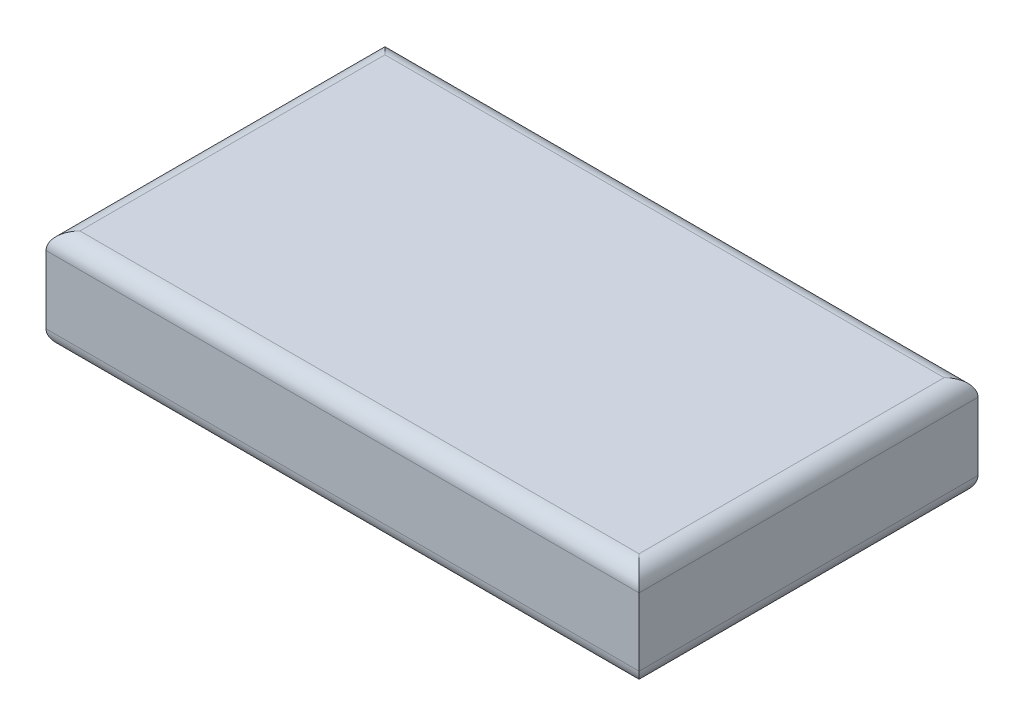
ISO-10303-21;
HEADER;
FILE_DESCRIPTION(('STEP AP214'),'2;1');
FILE_NAME('part.step','',(''),(''),'','','');
FILE_SCHEMA(('AUTOMOTIVE_DESIGN { 1 0 10303 214 1 1 1 1 }'));
ENDSEC;
DATA;
#1=APPLICATION_CONTEXT('core data for automotive mechanical design processes');
#2=APPLICATION_PROTOCOL_DEFINITION('international standard','automotive_design',2000,#1);
#3=PRODUCT_CONTEXT('',#1,'mechanical');
#4=PRODUCT('Part','Part','',(#3));
#5=PRODUCT_RELATED_PRODUCT_CATEGORY('part','',(#4));
#6=PRODUCT_DEFINITION_FORMATION('','',#4);
#7=PRODUCT_DEFINITION_CONTEXT('part definition',#1,'design');
#8=PRODUCT_DEFINITION('design','',#6,#7);
#9=PRODUCT_DEFINITION_SHAPE('','',#8);
#10=(LENGTH_UNIT() NAMED_UNIT(*) SI_UNIT(.MILLI.,.METRE.));
#11=(NAMED_UNIT(*) PLANE_ANGLE_UNIT() SI_UNIT($,.RADIAN.));
#12=(NAMED_UNIT(*) SI_UNIT($,.STERADIAN.) SOLID_ANGLE_UNIT());
#13=UNCERTAINTY_MEASURE_WITH_UNIT(LENGTH_MEASURE(1.E-05),#10,'distance_accuracy_value','');
#14=(GEOMETRIC_REPRESENTATION_CONTEXT(3) GLOBAL_UNCERTAINTY_ASSIGNED_CONTEXT((#13)) GLOBAL_UNIT_ASSIGNED_CONTEXT((#10,
#11,#12)) REPRESENTATION_CONTEXT('',''));
#15=CARTESIAN_POINT('',(0.,0.,0.));
#16=DIRECTION('',(0.,0.,1.));
#17=DIRECTION('',(1.,0.,0.));
#18=AXIS2_PLACEMENT_3D('',#15,#16,#17);
#19=CARTESIAN_POINT('',(17.5,6.,-10.));
#20=DIRECTION('',(-1.,0.,0.));
#21=DIRECTION('',(0.,0.,1.));
#22=AXIS2_PLACEMENT_3D('',#19,#20,#21);
#23=PLANE('',#22);
#24=DIRECTION('',(0.,-1.,0.));
#25=VECTOR('',#24,1.);
#26=CARTESIAN_POINT('',(17.5,6.,10.));
#27=LINE('',#26,#25);
#28=CARTESIAN_POINT('',(17.5,5.,10.));
#29=VERTEX_POINT('',#28);
#30=CARTESIAN_POINT('',(17.5,1.,10.));
#31=VERTEX_POINT('',#30);
#32=EDGE_CURVE('E158',#29,#31,#27,.T.);
#33=ORIENTED_EDGE('',*,*,#32,.T.);
#34=DIRECTION('',(0.,0.,-1.));
#35=VECTOR('',#34,1.);
#36=CARTESIAN_POINT('',(17.5,1.,-10.));
#37=LINE('',#36,#35);
#38=CARTESIAN_POINT('',(17.5,1.,-10.));
#39=VERTEX_POINT('',#38);
#40=EDGE_CURVE('E172',#31,#39,#37,.T.);
#41=ORIENTED_EDGE('',*,*,#40,.T.);
#42=DIRECTION('',(0.,-1.,0.));
#43=VECTOR('',#42,1.);
#44=CARTESIAN_POINT('',(17.5,6.,-10.));
#45=LINE('',#44,#43);
#46=CARTESIAN_POINT('',(17.5,5.,-10.));
#47=VERTEX_POINT('',#46);
#48=EDGE_CURVE('E129',#47,#39,#45,.T.);
#49=ORIENTED_EDGE('',*,*,#48,.F.);
#50=DIRECTION('',(0.,0.,-1.));
#51=VECTOR('',#50,1.);
#52=CARTESIAN_POINT('',(17.5,5.,10.));
#53=LINE('',#52,#51);
#54=EDGE_CURVE('E175',#47,#29,#53,.F.);
#55=ORIENTED_EDGE('',*,*,#54,.T.);
#56=EDGE_LOOP('',(#33,#41,#49,#55));
#57=FACE_BOUND('',#56,.T.);
#58=ADVANCED_FACE('F39',(#57),#23,.F.);
#59=CARTESIAN_POINT('',(-17.5,6.,-10.));
#60=DIRECTION('',(0.,0.,1.));
#61=DIRECTION('',(1.,0.,0.));
#62=AXIS2_PLACEMENT_3D('',#59,#60,#61);
#63=PLANE('',#62);
#64=ORIENTED_EDGE('',*,*,#48,.T.);
#65=DIRECTION('',(-1.,0.,0.));
#66=VECTOR('',#65,1.);
#67=CARTESIAN_POINT('',(-17.5,1.,-10.));
#68=LINE('',#67,#66);
#69=CARTESIAN_POINT('',(-17.5,1.,-10.));
#70=VERTEX_POINT('',#69);
#71=EDGE_CURVE('E127',#39,#70,#68,.T.);
#72=ORIENTED_EDGE('',*,*,#71,.T.);
#73=DIRECTION('',(0.,-1.,0.));
#74=VECTOR('',#73,1.);
#75=CARTESIAN_POINT('',(-17.5,6.,-10.));
#76=LINE('',#75,#74);
#77=CARTESIAN_POINT('',(-17.5,5.,-10.));
#78=VERTEX_POINT('',#77);
#79=EDGE_CURVE('E109',#78,#70,#76,.T.);
#80=ORIENTED_EDGE('',*,*,#79,.F.);
#81=DIRECTION('',(-1.,0.,0.));
#82=VECTOR('',#81,1.);
#83=CARTESIAN_POINT('',(17.5,5.,-10.));
#84=LINE('',#83,#82);
#85=EDGE_CURVE('E124',#78,#47,#84,.F.);
#86=ORIENTED_EDGE('',*,*,#85,.T.);
#87=EDGE_LOOP('',(#64,#72,#80,#86));
#88=FACE_BOUND('',#87,.T.);
#89=ADVANCED_FACE('F123',(#88),#63,.F.);
#90=CARTESIAN_POINT('',(-17.5,6.,-10.));
#91=DIRECTION('',(1.,0.,0.));
#92=DIRECTION('',(0.,0.,-1.));
#93=AXIS2_PLACEMENT_3D('',#90,#91,#92);
#94=PLANE('',#93);
#95=ORIENTED_EDGE('',*,*,#79,.T.);
#96=DIRECTION('',(0.,0.,1.));
#97=VECTOR('',#96,1.);
#98=CARTESIAN_POINT('',(-17.5,1.,-10.));
#99=LINE('',#98,#97);
#100=CARTESIAN_POINT('',(-17.5,1.,10.));
#101=VERTEX_POINT('',#100);
#102=EDGE_CURVE('E116',#70,#101,#99,.T.);
#103=ORIENTED_EDGE('',*,*,#102,.T.);
#104=DIRECTION('',(0.,-1.,0.));
#105=VECTOR('',#104,1.);
#106=CARTESIAN_POINT('',(-17.5,6.,10.));
#107=LINE('',#106,#105);
#108=CARTESIAN_POINT('',(-17.5,5.,10.));
#109=VERTEX_POINT('',#108);
#110=EDGE_CURVE('E111',#109,#101,#107,.T.);
#111=ORIENTED_EDGE('',*,*,#110,.F.);
#112=DIRECTION('',(0.,0.,1.));
#113=VECTOR('',#112,1.);
#114=CARTESIAN_POINT('',(-17.5,5.,-10.));
#115=LINE('',#114,#113);
#116=EDGE_CURVE('E106',#109,#78,#115,.F.);
#117=ORIENTED_EDGE('',*,*,#116,.T.);
#118=EDGE_LOOP('',(#95,#103,#111,#117));
#119=FACE_BOUND('',#118,.T.);
#120=ADVANCED_FACE('F108',(#119),#94,.F.);
#121=CARTESIAN_POINT('',(-17.5,6.,10.));
#122=DIRECTION('',(0.,0.,-1.));
#123=DIRECTION('',(-1.,0.,0.));
#124=AXIS2_PLACEMENT_3D('',#121,#122,#123);
#125=PLANE('',#124);
#126=ORIENTED_EDGE('',*,*,#110,.T.);
#127=DIRECTION('',(1.,0.,0.));
#128=VECTOR('',#127,1.);
#129=CARTESIAN_POINT('',(-17.5,1.,10.));
#130=LINE('',#129,#128);
#131=EDGE_CURVE('E178',#101,#31,#130,.T.);
#132=ORIENTED_EDGE('',*,*,#131,.T.);
#133=ORIENTED_EDGE('',*,*,#32,.F.);
#134=DIRECTION('',(1.,0.,0.));
#135=VECTOR('',#134,1.);
#136=CARTESIAN_POINT('',(-17.5,5.,10.));
#137=LINE('',#136,#135);
#138=EDGE_CURVE('E181',#29,#109,#137,.F.);
#139=ORIENTED_EDGE('',*,*,#138,.T.);
#140=EDGE_LOOP('',(#126,#132,#133,#139));
#141=FACE_BOUND('',#140,.T.);
#142=ADVANCED_FACE('F229',(#141),#125,.F.);
#143=CARTESIAN_POINT('',(0.,6.,0.));
#144=DIRECTION('',(0.,1.,0.));
#145=DIRECTION('',(0.,0.,1.));
#146=AXIS2_PLACEMENT_3D('',#143,#144,#145);
#147=PLANE('',#146);
#148=DIRECTION('',(0.,0.,1.));
#149=VECTOR('',#148,1.);
#150=CARTESIAN_POINT('',(-16.5,6.,10.));
#151=LINE('',#150,#149);
#152=CARTESIAN_POINT('',(-16.5,6.,-9.));
#153=VERTEX_POINT('',#152);
#154=CARTESIAN_POINT('',(-16.5,6.,9.00000000000001));
#155=VERTEX_POINT('',#154);
#156=EDGE_CURVE('E49',#153,#155,#151,.T.);
#157=ORIENTED_EDGE('',*,*,#156,.T.);
#158=DIRECTION('',(1.,0.,0.));
#159=VECTOR('',#158,1.);
#160=CARTESIAN_POINT('',(17.5,6.,9.00000000000001));
#161=LINE('',#160,#159);
#162=CARTESIAN_POINT('',(16.5,6.,9.00000000000001));
#163=VERTEX_POINT('',#162);
#164=EDGE_CURVE('E11',#155,#163,#161,.T.);
#165=ORIENTED_EDGE('',*,*,#164,.T.);
#166=DIRECTION('',(0.,0.,-1.));
#167=VECTOR('',#166,1.);
#168=CARTESIAN_POINT('',(16.5,6.,-10.));
#169=LINE('',#168,#167);
#170=CARTESIAN_POINT('',(16.5,6.,-9.));
#171=VERTEX_POINT('',#170);
#172=EDGE_CURVE('E169',#163,#171,#169,.T.);
#173=ORIENTED_EDGE('',*,*,#172,.T.);
#174=DIRECTION('',(-1.,0.,0.));
#175=VECTOR('',#174,1.);
#176=CARTESIAN_POINT('',(-17.5,6.,-9.));
#177=LINE('',#176,#175);
#178=EDGE_CURVE('E60',#171,#153,#177,.T.);
#179=ORIENTED_EDGE('',*,*,#178,.T.);
#180=EDGE_LOOP('',(#157,#165,#173,#179));
#181=FACE_BOUND('',#180,.T.);
#182=ADVANCED_FACE('F235',(#181),#147,.T.);
#183=CARTESIAN_POINT('',(0.,0.,0.));
#184=DIRECTION('',(0.,1.,0.));
#185=DIRECTION('',(0.,0.,1.));
#186=AXIS2_PLACEMENT_3D('',#183,#184,#185);
#187=PLANE('',#186);
#188=DIRECTION('',(0.,0.,1.));
#189=VECTOR('',#188,1.);
#190=CARTESIAN_POINT('',(-16.5,0.,0.));
#191=LINE('',#190,#189);
#192=CARTESIAN_POINT('',(-16.5,0.,9.00000000000001));
#193=VERTEX_POINT('',#192);
#194=CARTESIAN_POINT('',(-16.5,0.,-9.));
#195=VERTEX_POINT('',#194);
#196=EDGE_CURVE('E189',#193,#195,#191,.F.);
#197=ORIENTED_EDGE('',*,*,#196,.T.);
#198=DIRECTION('',(-1.,0.,0.));
#199=VECTOR('',#198,1.);
#200=CARTESIAN_POINT('',(0.,0.,-9.));
#201=LINE('',#200,#199);
#202=CARTESIAN_POINT('',(16.5,0.,-9.));
#203=VERTEX_POINT('',#202);
#204=EDGE_CURVE('E117',#195,#203,#201,.F.);
#205=ORIENTED_EDGE('',*,*,#204,.T.);
#206=DIRECTION('',(0.,0.,-1.));
#207=VECTOR('',#206,1.);
#208=CARTESIAN_POINT('',(16.5,0.,0.));
#209=LINE('',#208,#207);
#210=CARTESIAN_POINT('',(16.5,0.,9.00000000000001));
#211=VERTEX_POINT('',#210);
#212=EDGE_CURVE('E195',#203,#211,#209,.F.);
#213=ORIENTED_EDGE('',*,*,#212,.T.);
#214=DIRECTION('',(1.,0.,0.));
#215=VECTOR('',#214,1.);
#216=CARTESIAN_POINT('',(0.,0.,9.00000000000001));
#217=LINE('',#216,#215);
#218=EDGE_CURVE('E192',#211,#193,#217,.F.);
#219=ORIENTED_EDGE('',*,*,#218,.T.);
#220=EDGE_LOOP('',(#197,#205,#213,#219));
#221=FACE_BOUND('',#220,.T.);
#222=ADVANCED_FACE('F237',(#221),#187,.F.);
#223=CARTESIAN_POINT('',(-17.5,1.,9.00000000000001));
#224=DIRECTION('',(1.,0.,0.));
#225=DIRECTION('',(0.,0.,-1.));
#226=AXIS2_PLACEMENT_3D('',#223,#224,#225);
#227=CYLINDRICAL_SURFACE('',#226,1.);
#228=CARTESIAN_POINT('',(-16.5,1.,9.00000000000001));
#229=DIRECTION('',(0.707106781186548,0.,0.707106781186547));
#230=DIRECTION('',(0.707106781186547,0.,-0.707106781186548));
#231=AXIS2_PLACEMENT_3D('',#228,#229,#230);
#232=ELLIPSE('',#231,1.41421356237309,1.);
#233=EDGE_CURVE('E159',#193,#101,#232,.F.);
#234=ORIENTED_EDGE('',*,*,#233,.F.);
#235=ORIENTED_EDGE('',*,*,#218,.F.);
#236=CARTESIAN_POINT('',(16.5,1.,9.00000000000001));
#237=DIRECTION('',(0.707106781186547,0.,-0.707106781186548));
#238=DIRECTION('',(-0.707106781186548,0.,-0.707106781186547));
#239=AXIS2_PLACEMENT_3D('',#236,#237,#238);
#240=ELLIPSE('',#239,1.4142135623731,1.);
#241=EDGE_CURVE('E154',#31,#211,#240,.T.);
#242=ORIENTED_EDGE('',*,*,#241,.F.);
#243=ORIENTED_EDGE('',*,*,#131,.F.);
#244=EDGE_LOOP('',(#234,#235,#242,#243));
#245=FACE_BOUND('',#244,.T.);
#246=ADVANCED_FACE('F216',(#245),#227,.T.);
#247=CARTESIAN_POINT('',(16.5,1.,-10.));
#248=DIRECTION('',(0.,0.,-1.));
#249=DIRECTION('',(-1.,0.,0.));
#250=AXIS2_PLACEMENT_3D('',#247,#248,#249);
#251=CYLINDRICAL_SURFACE('',#250,1.);
#252=ORIENTED_EDGE('',*,*,#241,.T.);
#253=ORIENTED_EDGE('',*,*,#212,.F.);
#254=CARTESIAN_POINT('',(16.5,1.,-9.));
#255=DIRECTION('',(-0.707106781186548,0.,-0.707106781186547));
#256=DIRECTION('',(0.707106781186547,0.,-0.707106781186548));
#257=AXIS2_PLACEMENT_3D('',#254,#255,#256);
#258=ELLIPSE('',#257,1.41421356237309,1.);
#259=EDGE_CURVE('E143',#39,#203,#258,.T.);
#260=ORIENTED_EDGE('',*,*,#259,.F.);
#261=ORIENTED_EDGE('',*,*,#40,.F.);
#262=EDGE_LOOP('',(#252,#253,#260,#261));
#263=FACE_BOUND('',#262,.T.);
#264=ADVANCED_FACE('F220',(#263),#251,.T.);
#265=CARTESIAN_POINT('',(-16.5,1.,-10.));
#266=DIRECTION('',(0.,0.,1.));
#267=DIRECTION('',(1.,0.,0.));
#268=AXIS2_PLACEMENT_3D('',#265,#266,#267);
#269=CYLINDRICAL_SURFACE('',#268,1.);
#270=ORIENTED_EDGE('',*,*,#233,.T.);
#271=ORIENTED_EDGE('',*,*,#102,.F.);
#272=CARTESIAN_POINT('',(-16.5,1.,-9.));
#273=DIRECTION('',(-0.707106781186547,0.,0.707106781186548));
#274=DIRECTION('',(0.707106781186548,0.,0.707106781186547));
#275=AXIS2_PLACEMENT_3D('',#272,#273,#274);
#276=ELLIPSE('',#275,1.4142135623731,1.);
#277=EDGE_CURVE('E140',#195,#70,#276,.F.);
#278=ORIENTED_EDGE('',*,*,#277,.F.);
#279=ORIENTED_EDGE('',*,*,#196,.F.);
#280=EDGE_LOOP('',(#270,#271,#278,#279));
#281=FACE_BOUND('',#280,.T.);
#282=ADVANCED_FACE('F228',(#281),#269,.T.);
#283=CARTESIAN_POINT('',(-17.5,1.,-9.));
#284=DIRECTION('',(-1.,0.,0.));
#285=DIRECTION('',(0.,0.,1.));
#286=AXIS2_PLACEMENT_3D('',#283,#284,#285);
#287=CYLINDRICAL_SURFACE('',#286,1.);
#288=ORIENTED_EDGE('',*,*,#259,.T.);
#289=ORIENTED_EDGE('',*,*,#204,.F.);
#290=ORIENTED_EDGE('',*,*,#277,.T.);
#291=ORIENTED_EDGE('',*,*,#71,.F.);
#292=EDGE_LOOP('',(#288,#289,#290,#291));
#293=FACE_BOUND('',#292,.T.);
#294=ADVANCED_FACE('F223',(#293),#287,.T.);
#295=CARTESIAN_POINT('',(0.,5.,-9.));
#296=DIRECTION('',(1.,0.,0.));
#297=DIRECTION('',(0.,0.,-1.));
#298=AXIS2_PLACEMENT_3D('',#295,#296,#297);
#299=CYLINDRICAL_SURFACE('',#298,1.);
#300=CARTESIAN_POINT('',(16.5,5.,-9.));
#301=DIRECTION('',(0.707106781186548,0.,0.707106781186547));
#302=DIRECTION('',(-0.707106781186547,0.,0.707106781186548));
#303=AXIS2_PLACEMENT_3D('',#300,#301,#302);
#304=ELLIPSE('',#303,1.41421356237309,1.);
#305=EDGE_CURVE('E134',#47,#171,#304,.T.);
#306=ORIENTED_EDGE('',*,*,#305,.F.);
#307=ORIENTED_EDGE('',*,*,#85,.F.);
#308=CARTESIAN_POINT('',(-16.5,5.,-9.));
#309=DIRECTION('',(0.707106781186547,0.,-0.707106781186548));
#310=DIRECTION('',(0.707106781186548,0.,0.707106781186547));
#311=AXIS2_PLACEMENT_3D('',#308,#309,#310);
#312=ELLIPSE('',#311,1.4142135623731,1.);
#313=EDGE_CURVE('E43',#153,#78,#312,.F.);
#314=ORIENTED_EDGE('',*,*,#313,.F.);
#315=ORIENTED_EDGE('',*,*,#178,.F.);
#316=EDGE_LOOP('',(#306,#307,#314,#315));
#317=FACE_BOUND('',#316,.T.);
#318=ADVANCED_FACE('F41',(#317),#299,.T.);
#319=CARTESIAN_POINT('',(-16.5,5.,0.));
#320=DIRECTION('',(0.,0.,-1.));
#321=DIRECTION('',(-1.,0.,0.));
#322=AXIS2_PLACEMENT_3D('',#319,#320,#321);
#323=CYLINDRICAL_SURFACE('',#322,1.);
#324=ORIENTED_EDGE('',*,*,#313,.T.);
#325=ORIENTED_EDGE('',*,*,#116,.F.);
#326=CARTESIAN_POINT('',(-16.5,5.,9.00000000000001));
#327=DIRECTION('',(-0.707106781186548,0.,-0.707106781186547));
#328=DIRECTION('',(0.707106781186547,0.,-0.707106781186548));
#329=AXIS2_PLACEMENT_3D('',#326,#327,#328);
#330=ELLIPSE('',#329,1.41421356237309,1.);
#331=EDGE_CURVE('E145',#155,#109,#330,.F.);
#332=ORIENTED_EDGE('',*,*,#331,.F.);
#333=ORIENTED_EDGE('',*,*,#156,.F.);
#334=EDGE_LOOP('',(#324,#325,#332,#333));
#335=FACE_BOUND('',#334,.T.);
#336=ADVANCED_FACE('F138',(#335),#323,.T.);
#337=CARTESIAN_POINT('',(16.5,5.,0.));
#338=DIRECTION('',(0.,0.,1.));
#339=DIRECTION('',(1.,0.,0.));
#340=AXIS2_PLACEMENT_3D('',#337,#338,#339);
#341=CYLINDRICAL_SURFACE('',#340,1.);
#342=ORIENTED_EDGE('',*,*,#305,.T.);
#343=ORIENTED_EDGE('',*,*,#172,.F.);
#344=CARTESIAN_POINT('',(16.5,5.,9.00000000000001));
#345=DIRECTION('',(-0.707106781186547,0.,0.707106781186548));
#346=DIRECTION('',(0.707106781186548,0.,0.707106781186547));
#347=AXIS2_PLACEMENT_3D('',#344,#345,#346);
#348=ELLIPSE('',#347,1.4142135623731,1.);
#349=EDGE_CURVE('E149',#29,#163,#348,.T.);
#350=ORIENTED_EDGE('',*,*,#349,.F.);
#351=ORIENTED_EDGE('',*,*,#54,.F.);
#352=EDGE_LOOP('',(#342,#343,#350,#351));
#353=FACE_BOUND('',#352,.T.);
#354=ADVANCED_FACE('F234',(#353),#341,.T.);
#355=CARTESIAN_POINT('',(0.,5.,9.00000000000001));
#356=DIRECTION('',(-1.,0.,0.));
#357=DIRECTION('',(0.,0.,1.));
#358=AXIS2_PLACEMENT_3D('',#355,#356,#357);
#359=CYLINDRICAL_SURFACE('',#358,1.);
#360=ORIENTED_EDGE('',*,*,#331,.T.);
#361=ORIENTED_EDGE('',*,*,#138,.F.);
#362=ORIENTED_EDGE('',*,*,#349,.T.);
#363=ORIENTED_EDGE('',*,*,#164,.F.);
#364=EDGE_LOOP('',(#360,#361,#362,#363));
#365=FACE_BOUND('',#364,.T.);
#366=ADVANCED_FACE('F232',(#365),#359,.T.);
#367=CLOSED_SHELL('',(#58,#89,#120,#142,#182,#222,#246,#264,#282,#294,#318,#336,#354,#366));
#368=MANIFOLD_SOLID_BREP('B2',#367);
#369=ADVANCED_BREP_SHAPE_REPRESENTATION('',(#18,#368),#14);
#370=SHAPE_DEFINITION_REPRESENTATION(#9,#369);
ENDSEC;
END-ISO-10303-21;
